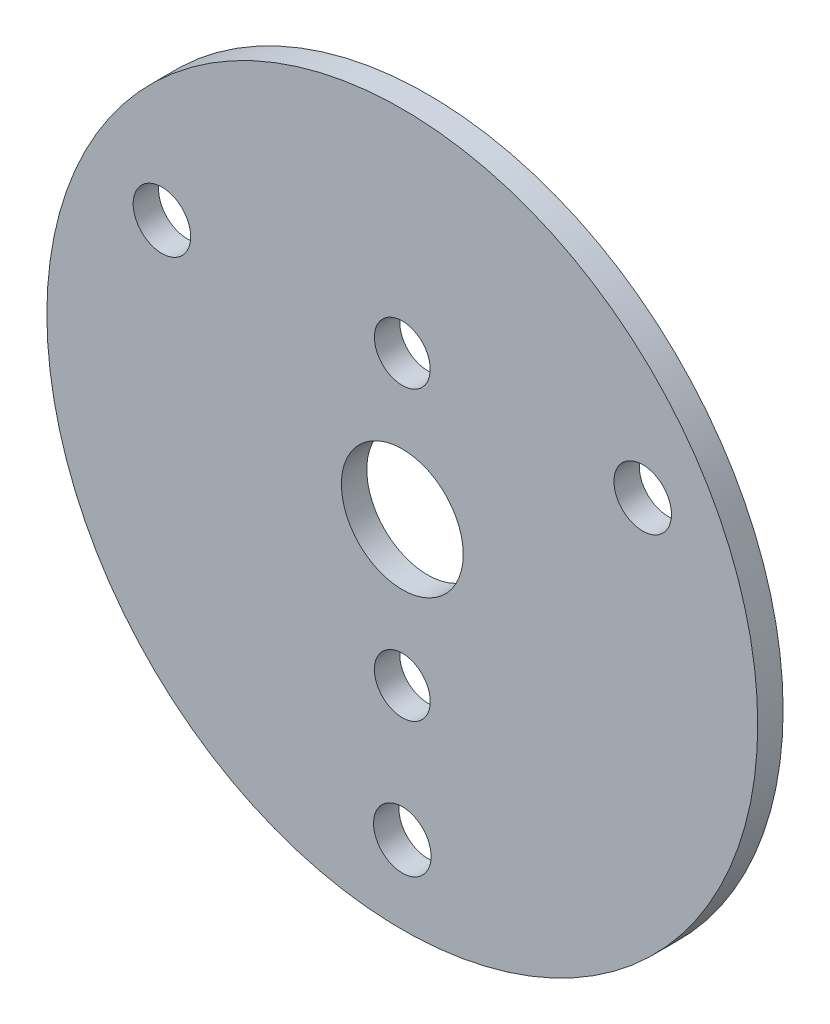
ISO-10303-21;
HEADER;
FILE_DESCRIPTION(('STEP AP214'),'2;1');
FILE_NAME('part.step','',(''),(''),'','','');
FILE_SCHEMA(('AUTOMOTIVE_DESIGN { 1 0 10303 214 1 1 1 1 }'));
ENDSEC;
DATA;
#1=APPLICATION_CONTEXT('core data for automotive mechanical design processes');
#2=APPLICATION_PROTOCOL_DEFINITION('international standard','automotive_design',2000,#1);
#3=PRODUCT_CONTEXT('',#1,'mechanical');
#4=PRODUCT('Part','Part','',(#3));
#5=PRODUCT_RELATED_PRODUCT_CATEGORY('part','',(#4));
#6=PRODUCT_DEFINITION_FORMATION('','',#4);
#7=PRODUCT_DEFINITION_CONTEXT('part definition',#1,'design');
#8=PRODUCT_DEFINITION('design','',#6,#7);
#9=PRODUCT_DEFINITION_SHAPE('','',#8);
#10=(LENGTH_UNIT() NAMED_UNIT(*) SI_UNIT(.MILLI.,.METRE.));
#11=(NAMED_UNIT(*) PLANE_ANGLE_UNIT() SI_UNIT($,.RADIAN.));
#12=(NAMED_UNIT(*) SI_UNIT($,.STERADIAN.) SOLID_ANGLE_UNIT());
#13=UNCERTAINTY_MEASURE_WITH_UNIT(LENGTH_MEASURE(1.E-05),#10,'distance_accuracy_value','');
#14=(GEOMETRIC_REPRESENTATION_CONTEXT(3) GLOBAL_UNCERTAINTY_ASSIGNED_CONTEXT((#13)) GLOBAL_UNIT_ASSIGNED_CONTEXT((#10,
#11,#12)) REPRESENTATION_CONTEXT('',''));
#15=CARTESIAN_POINT('',(0.,0.,0.));
#16=DIRECTION('',(0.,0.,1.));
#17=DIRECTION('',(1.,0.,0.));
#18=AXIS2_PLACEMENT_3D('',#15,#16,#17);
#19=CARTESIAN_POINT('',(0.,0.,1.5));
#20=DIRECTION('',(0.,0.,1.));
#21=DIRECTION('',(1.,0.,0.));
#22=AXIS2_PLACEMENT_3D('',#19,#20,#21);
#23=PLANE('',#22);
#24=CARTESIAN_POINT('',(0.,8.5,1.5));
#25=DIRECTION('',(0.,0.,1.));
#26=DIRECTION('',(1.,0.,0.));
#27=AXIS2_PLACEMENT_3D('',#24,#25,#26);
#28=CIRCLE('',#27,1.65);
#29=CARTESIAN_POINT('',(1.65,8.5,1.5));
#30=VERTEX_POINT('',#29);
#31=EDGE_CURVE('E58',#30,#30,#28,.F.);
#32=ORIENTED_EDGE('',*,*,#31,.T.);
#33=EDGE_LOOP('',(#32));
#34=FACE_BOUND('',#33,.T.);
#35=CARTESIAN_POINT('',(0.,-8.5,1.5));
#36=DIRECTION('',(0.,0.,1.));
#37=DIRECTION('',(1.,0.,0.));
#38=AXIS2_PLACEMENT_3D('',#35,#36,#37);
#39=CIRCLE('',#38,1.65);
#40=CARTESIAN_POINT('',(1.65,-8.5,1.5));
#41=VERTEX_POINT('',#40);
#42=EDGE_CURVE('E69',#41,#41,#39,.F.);
#43=ORIENTED_EDGE('',*,*,#42,.T.);
#44=EDGE_LOOP('',(#43));
#45=FACE_BOUND('',#44,.T.);
#46=CARTESIAN_POINT('',(14.2028166220648,8.2,1.5));
#47=DIRECTION('',(0.,0.,1.));
#48=DIRECTION('',(1.,0.,0.));
#49=AXIS2_PLACEMENT_3D('',#46,#47,#48);
#50=CIRCLE('',#49,1.7);
#51=CARTESIAN_POINT('',(15.9028166220648,8.2,1.5));
#52=VERTEX_POINT('',#51);
#53=EDGE_CURVE('E70',#52,#52,#50,.F.);
#54=ORIENTED_EDGE('',*,*,#53,.T.);
#55=EDGE_LOOP('',(#54));
#56=FACE_BOUND('',#55,.T.);
#57=CARTESIAN_POINT('',(-14.2028166220648,8.2,1.5));
#58=DIRECTION('',(0.,0.,1.));
#59=DIRECTION('',(1.,0.,0.));
#60=AXIS2_PLACEMENT_3D('',#57,#58,#59);
#61=CIRCLE('',#60,1.7);
#62=CARTESIAN_POINT('',(-12.5028166220648,8.2,1.5));
#63=VERTEX_POINT('',#62);
#64=EDGE_CURVE('E63',#63,#63,#61,.F.);
#65=ORIENTED_EDGE('',*,*,#64,.T.);
#66=EDGE_LOOP('',(#65));
#67=FACE_BOUND('',#66,.T.);
#68=CARTESIAN_POINT('',(0.,-16.4,1.5));
#69=DIRECTION('',(0.,0.,1.));
#70=DIRECTION('',(1.,0.,0.));
#71=AXIS2_PLACEMENT_3D('',#68,#69,#70);
#72=CIRCLE('',#71,1.7);
#73=CARTESIAN_POINT('',(1.7,-16.4,1.5));
#74=VERTEX_POINT('',#73);
#75=EDGE_CURVE('E56',#74,#74,#72,.F.);
#76=ORIENTED_EDGE('',*,*,#75,.T.);
#77=EDGE_LOOP('',(#76));
#78=FACE_BOUND('',#77,.T.);
#79=CARTESIAN_POINT('',(0.,0.,1.5));
#80=DIRECTION('',(0.,0.,1.));
#81=DIRECTION('',(1.,0.,0.));
#82=AXIS2_PLACEMENT_3D('',#79,#80,#81);
#83=CIRCLE('',#82,21.);
#84=CARTESIAN_POINT('',(21.,0.,1.5));
#85=VERTEX_POINT('',#84);
#86=EDGE_CURVE('E10',#85,#85,#83,.T.);
#87=ORIENTED_EDGE('',*,*,#86,.T.);
#88=EDGE_LOOP('',(#87));
#89=FACE_BOUND('',#88,.T.);
#90=CARTESIAN_POINT('',(0.,0.,1.5));
#91=DIRECTION('',(0.,0.,1.));
#92=DIRECTION('',(1.,0.,0.));
#93=AXIS2_PLACEMENT_3D('',#90,#91,#92);
#94=CIRCLE('',#93,3.6);
#95=CARTESIAN_POINT('',(3.6,0.,1.5));
#96=VERTEX_POINT('',#95);
#97=EDGE_CURVE('E49',#96,#96,#94,.T.);
#98=ORIENTED_EDGE('',*,*,#97,.F.);
#99=EDGE_LOOP('',(#98));
#100=FACE_BOUND('',#99,.T.);
#101=ADVANCED_FACE('F40',(#34,#45,#56,#67,#78,#89,#100),#23,.T.);
#102=CARTESIAN_POINT('',(0.,0.,0.));
#103=DIRECTION('',(0.,0.,1.));
#104=DIRECTION('',(1.,0.,0.));
#105=AXIS2_PLACEMENT_3D('',#102,#103,#104);
#106=PLANE('',#105);
#107=CARTESIAN_POINT('',(0.,8.5,0.));
#108=DIRECTION('',(0.,0.,1.));
#109=DIRECTION('',(1.,0.,0.));
#110=AXIS2_PLACEMENT_3D('',#107,#108,#109);
#111=CIRCLE('',#110,1.65);
#112=CARTESIAN_POINT('',(1.65,8.5,0.));
#113=VERTEX_POINT('',#112);
#114=EDGE_CURVE('E41',#113,#113,#111,.F.);
#115=ORIENTED_EDGE('',*,*,#114,.F.);
#116=EDGE_LOOP('',(#115));
#117=FACE_BOUND('',#116,.T.);
#118=CARTESIAN_POINT('',(0.,-8.5,0.));
#119=DIRECTION('',(0.,0.,1.));
#120=DIRECTION('',(1.,0.,0.));
#121=AXIS2_PLACEMENT_3D('',#118,#119,#120);
#122=CIRCLE('',#121,1.65);
#123=CARTESIAN_POINT('',(1.65,-8.5,0.));
#124=VERTEX_POINT('',#123);
#125=EDGE_CURVE('E67',#124,#124,#122,.F.);
#126=ORIENTED_EDGE('',*,*,#125,.F.);
#127=EDGE_LOOP('',(#126));
#128=FACE_BOUND('',#127,.T.);
#129=CARTESIAN_POINT('',(14.2028166220648,8.2,0.));
#130=DIRECTION('',(0.,0.,1.));
#131=DIRECTION('',(1.,0.,0.));
#132=AXIS2_PLACEMENT_3D('',#129,#130,#131);
#133=CIRCLE('',#132,1.7);
#134=CARTESIAN_POINT('',(15.9028166220648,8.2,0.));
#135=VERTEX_POINT('',#134);
#136=EDGE_CURVE('E65',#135,#135,#133,.F.);
#137=ORIENTED_EDGE('',*,*,#136,.F.);
#138=EDGE_LOOP('',(#137));
#139=FACE_BOUND('',#138,.T.);
#140=CARTESIAN_POINT('',(-14.2028166220648,8.2,0.));
#141=DIRECTION('',(0.,0.,1.));
#142=DIRECTION('',(1.,0.,0.));
#143=AXIS2_PLACEMENT_3D('',#140,#141,#142);
#144=CIRCLE('',#143,1.7);
#145=CARTESIAN_POINT('',(-12.5028166220648,8.2,0.));
#146=VERTEX_POINT('',#145);
#147=EDGE_CURVE('E61',#146,#146,#144,.F.);
#148=ORIENTED_EDGE('',*,*,#147,.F.);
#149=EDGE_LOOP('',(#148));
#150=FACE_BOUND('',#149,.T.);
#151=CARTESIAN_POINT('',(0.,-16.4,0.));
#152=DIRECTION('',(0.,0.,1.));
#153=DIRECTION('',(1.,0.,0.));
#154=AXIS2_PLACEMENT_3D('',#151,#152,#153);
#155=CIRCLE('',#154,1.7);
#156=CARTESIAN_POINT('',(1.7,-16.4,0.));
#157=VERTEX_POINT('',#156);
#158=EDGE_CURVE('E57',#157,#157,#155,.F.);
#159=ORIENTED_EDGE('',*,*,#158,.F.);
#160=EDGE_LOOP('',(#159));
#161=FACE_BOUND('',#160,.T.);
#162=CARTESIAN_POINT('',(0.,0.,0.));
#163=DIRECTION('',(0.,0.,1.));
#164=DIRECTION('',(1.,0.,0.));
#165=AXIS2_PLACEMENT_3D('',#162,#163,#164);
#166=CIRCLE('',#165,21.);
#167=CARTESIAN_POINT('',(21.,0.,0.));
#168=VERTEX_POINT('',#167);
#169=EDGE_CURVE('E44',#168,#168,#166,.T.);
#170=ORIENTED_EDGE('',*,*,#169,.F.);
#171=EDGE_LOOP('',(#170));
#172=FACE_BOUND('',#171,.T.);
#173=CARTESIAN_POINT('',(0.,0.,0.));
#174=DIRECTION('',(0.,0.,1.));
#175=DIRECTION('',(1.,0.,0.));
#176=AXIS2_PLACEMENT_3D('',#173,#174,#175);
#177=CIRCLE('',#176,3.6);
#178=CARTESIAN_POINT('',(3.6,0.,0.));
#179=VERTEX_POINT('',#178);
#180=EDGE_CURVE('E52',#179,#179,#177,.T.);
#181=ORIENTED_EDGE('',*,*,#180,.T.);
#182=EDGE_LOOP('',(#181));
#183=FACE_BOUND('',#182,.T.);
#184=ADVANCED_FACE('F95',(#117,#128,#139,#150,#161,#172,#183),#106,.F.);
#185=CARTESIAN_POINT('',(0.,0.,1.5));
#186=DIRECTION('',(0.,0.,-1.));
#187=DIRECTION('',(-1.,0.,0.));
#188=AXIS2_PLACEMENT_3D('',#185,#186,#187);
#189=CYLINDRICAL_SURFACE('',#188,21.);
#190=ORIENTED_EDGE('',*,*,#86,.F.);
#191=EDGE_LOOP('',(#190));
#192=FACE_BOUND('',#191,.T.);
#193=ORIENTED_EDGE('',*,*,#169,.T.);
#194=EDGE_LOOP('',(#193));
#195=FACE_BOUND('',#194,.T.);
#196=ADVANCED_FACE('F39',(#192,#195),#189,.T.);
#197=CARTESIAN_POINT('',(0.,0.,1.5));
#198=DIRECTION('',(0.,0.,-1.));
#199=DIRECTION('',(-1.,0.,0.));
#200=AXIS2_PLACEMENT_3D('',#197,#198,#199);
#201=CYLINDRICAL_SURFACE('',#200,3.6);
#202=ORIENTED_EDGE('',*,*,#97,.T.);
#203=EDGE_LOOP('',(#202));
#204=FACE_BOUND('',#203,.T.);
#205=ORIENTED_EDGE('',*,*,#180,.F.);
#206=EDGE_LOOP('',(#205));
#207=FACE_BOUND('',#206,.T.);
#208=ADVANCED_FACE('F94',(#204,#207),#201,.F.);
#209=CARTESIAN_POINT('',(0.,-16.4,1.6));
#210=DIRECTION('',(0.,0.,-1.));
#211=DIRECTION('',(-1.,0.,0.));
#212=AXIS2_PLACEMENT_3D('',#209,#210,#211);
#213=CYLINDRICAL_SURFACE('',#212,1.7);
#214=ORIENTED_EDGE('',*,*,#75,.F.);
#215=EDGE_LOOP('',(#214));
#216=FACE_BOUND('',#215,.T.);
#217=ORIENTED_EDGE('',*,*,#158,.T.);
#218=EDGE_LOOP('',(#217));
#219=FACE_BOUND('',#218,.T.);
#220=ADVANCED_FACE('F96',(#216,#219),#213,.F.);
#221=CARTESIAN_POINT('',(-14.2028166220648,8.2,1.6));
#222=DIRECTION('',(0.,0.,-1.));
#223=DIRECTION('',(-1.,0.,0.));
#224=AXIS2_PLACEMENT_3D('',#221,#222,#223);
#225=CYLINDRICAL_SURFACE('',#224,1.7);
#226=ORIENTED_EDGE('',*,*,#64,.F.);
#227=EDGE_LOOP('',(#226));
#228=FACE_BOUND('',#227,.T.);
#229=ORIENTED_EDGE('',*,*,#147,.T.);
#230=EDGE_LOOP('',(#229));
#231=FACE_BOUND('',#230,.T.);
#232=ADVANCED_FACE('F105',(#228,#231),#225,.F.);
#233=CARTESIAN_POINT('',(14.2028166220648,8.2,1.6));
#234=DIRECTION('',(0.,0.,-1.));
#235=DIRECTION('',(-1.,0.,0.));
#236=AXIS2_PLACEMENT_3D('',#233,#234,#235);
#237=CYLINDRICAL_SURFACE('',#236,1.7);
#238=ORIENTED_EDGE('',*,*,#53,.F.);
#239=EDGE_LOOP('',(#238));
#240=FACE_BOUND('',#239,.T.);
#241=ORIENTED_EDGE('',*,*,#136,.T.);
#242=EDGE_LOOP('',(#241));
#243=FACE_BOUND('',#242,.T.);
#244=ADVANCED_FACE('F131',(#240,#243),#237,.F.);
#245=CARTESIAN_POINT('',(0.,-8.5,1.6));
#246=DIRECTION('',(0.,0.,-1.));
#247=DIRECTION('',(-1.,0.,0.));
#248=AXIS2_PLACEMENT_3D('',#245,#246,#247);
#249=CYLINDRICAL_SURFACE('',#248,1.65);
#250=ORIENTED_EDGE('',*,*,#42,.F.);
#251=EDGE_LOOP('',(#250));
#252=FACE_BOUND('',#251,.T.);
#253=ORIENTED_EDGE('',*,*,#125,.T.);
#254=EDGE_LOOP('',(#253));
#255=FACE_BOUND('',#254,.T.);
#256=ADVANCED_FACE('F140',(#252,#255),#249,.F.);
#257=CARTESIAN_POINT('',(0.,8.5,1.6));
#258=DIRECTION('',(0.,0.,-1.));
#259=DIRECTION('',(-1.,0.,0.));
#260=AXIS2_PLACEMENT_3D('',#257,#258,#259);
#261=CYLINDRICAL_SURFACE('',#260,1.65);
#262=ORIENTED_EDGE('',*,*,#31,.F.);
#263=EDGE_LOOP('',(#262));
#264=FACE_BOUND('',#263,.T.);
#265=ORIENTED_EDGE('',*,*,#114,.T.);
#266=EDGE_LOOP('',(#265));
#267=FACE_BOUND('',#266,.T.);
#268=ADVANCED_FACE('F141',(#264,#267),#261,.F.);
#269=CLOSED_SHELL('',(#101,#184,#196,#208,#220,#232,#244,#256,#268));
#270=MANIFOLD_SOLID_BREP('B2',#269);
#271=ADVANCED_BREP_SHAPE_REPRESENTATION('',(#18,#270),#14);
#272=SHAPE_DEFINITION_REPRESENTATION(#9,#271);
ENDSEC;
END-ISO-10303-21;
